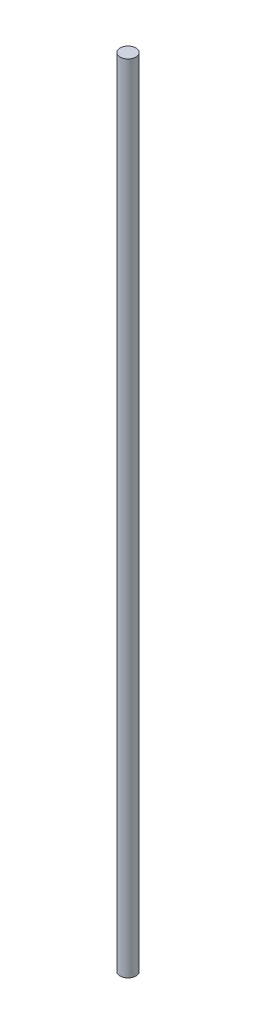
ISO-10303-21;
HEADER;
FILE_DESCRIPTION(('STEP AP214'),'2;1');
FILE_NAME('part.step','',(''),(''),'','','');
FILE_SCHEMA(('AUTOMOTIVE_DESIGN { 1 0 10303 214 1 1 1 1 }'));
ENDSEC;
DATA;
#1=APPLICATION_CONTEXT('core data for automotive mechanical design processes');
#2=APPLICATION_PROTOCOL_DEFINITION('international standard','automotive_design',2000,#1);
#3=PRODUCT_CONTEXT('',#1,'mechanical');
#4=PRODUCT('Part','Part','',(#3));
#5=PRODUCT_RELATED_PRODUCT_CATEGORY('part','',(#4));
#6=PRODUCT_DEFINITION_FORMATION('','',#4);
#7=PRODUCT_DEFINITION_CONTEXT('part definition',#1,'design');
#8=PRODUCT_DEFINITION('design','',#6,#7);
#9=PRODUCT_DEFINITION_SHAPE('','',#8);
#10=(LENGTH_UNIT() NAMED_UNIT(*) SI_UNIT(.MILLI.,.METRE.));
#11=(NAMED_UNIT(*) PLANE_ANGLE_UNIT() SI_UNIT($,.RADIAN.));
#12=(NAMED_UNIT(*) SI_UNIT($,.STERADIAN.) SOLID_ANGLE_UNIT());
#13=UNCERTAINTY_MEASURE_WITH_UNIT(LENGTH_MEASURE(1.E-05),#10,'distance_accuracy_value','');
#14=(GEOMETRIC_REPRESENTATION_CONTEXT(3) GLOBAL_UNCERTAINTY_ASSIGNED_CONTEXT((#13)) GLOBAL_UNIT_ASSIGNED_CONTEXT((#10,
#11,#12)) REPRESENTATION_CONTEXT('',''));
#15=CARTESIAN_POINT('',(0.,0.,0.));
#16=DIRECTION('',(0.,0.,1.));
#17=DIRECTION('',(1.,0.,0.));
#18=AXIS2_PLACEMENT_3D('',#15,#16,#17);
#19=CARTESIAN_POINT('',(0.,150.,0.));
#20=DIRECTION('',(0.,-1.,0.));
#21=DIRECTION('',(0.,0.,-1.));
#22=AXIS2_PLACEMENT_3D('',#19,#20,#21);
#23=CYLINDRICAL_SURFACE('',#22,1.5);
#24=CARTESIAN_POINT('',(0.,150.,0.));
#25=DIRECTION('',(0.,1.,0.));
#26=DIRECTION('',(0.,0.,1.));
#27=AXIS2_PLACEMENT_3D('',#24,#25,#26);
#28=CIRCLE('',#27,1.5);
#29=CARTESIAN_POINT('',(0.,150.,1.5));
#30=VERTEX_POINT('',#29);
#31=EDGE_CURVE('E10',#30,#30,#28,.T.);
#32=ORIENTED_EDGE('',*,*,#31,.F.);
#33=EDGE_LOOP('',(#32));
#34=FACE_BOUND('',#33,.T.);
#35=CARTESIAN_POINT('',(0.,0.,0.));
#36=DIRECTION('',(0.,1.,0.));
#37=DIRECTION('',(0.,0.,1.));
#38=AXIS2_PLACEMENT_3D('',#35,#36,#37);
#39=CIRCLE('',#38,1.5);
#40=CARTESIAN_POINT('',(0.,0.,1.5));
#41=VERTEX_POINT('',#40);
#42=EDGE_CURVE('E40',#41,#41,#39,.T.);
#43=ORIENTED_EDGE('',*,*,#42,.T.);
#44=EDGE_LOOP('',(#43));
#45=FACE_BOUND('',#44,.T.);
#46=ADVANCED_FACE('F37',(#34,#45),#23,.T.);
#47=CARTESIAN_POINT('',(0.,150.,0.));
#48=DIRECTION('',(0.,1.,0.));
#49=DIRECTION('',(0.,0.,1.));
#50=AXIS2_PLACEMENT_3D('',#47,#48,#49);
#51=PLANE('',#50);
#52=ORIENTED_EDGE('',*,*,#31,.T.);
#53=EDGE_LOOP('',(#52));
#54=FACE_BOUND('',#53,.T.);
#55=ADVANCED_FACE('F54',(#54),#51,.T.);
#56=CARTESIAN_POINT('',(0.,0.,0.));
#57=DIRECTION('',(0.,1.,0.));
#58=DIRECTION('',(0.,0.,1.));
#59=AXIS2_PLACEMENT_3D('',#56,#57,#58);
#60=PLANE('',#59);
#61=ORIENTED_EDGE('',*,*,#42,.F.);
#62=EDGE_LOOP('',(#61));
#63=FACE_BOUND('',#62,.T.);
#64=ADVANCED_FACE('F52',(#63),#60,.F.);
#65=CLOSED_SHELL('',(#46,#55,#64));
#66=MANIFOLD_SOLID_BREP('B2',#65);
#67=ADVANCED_BREP_SHAPE_REPRESENTATION('',(#18,#66),#14);
#68=SHAPE_DEFINITION_REPRESENTATION(#9,#67);
ENDSEC;
END-ISO-10303-21;
